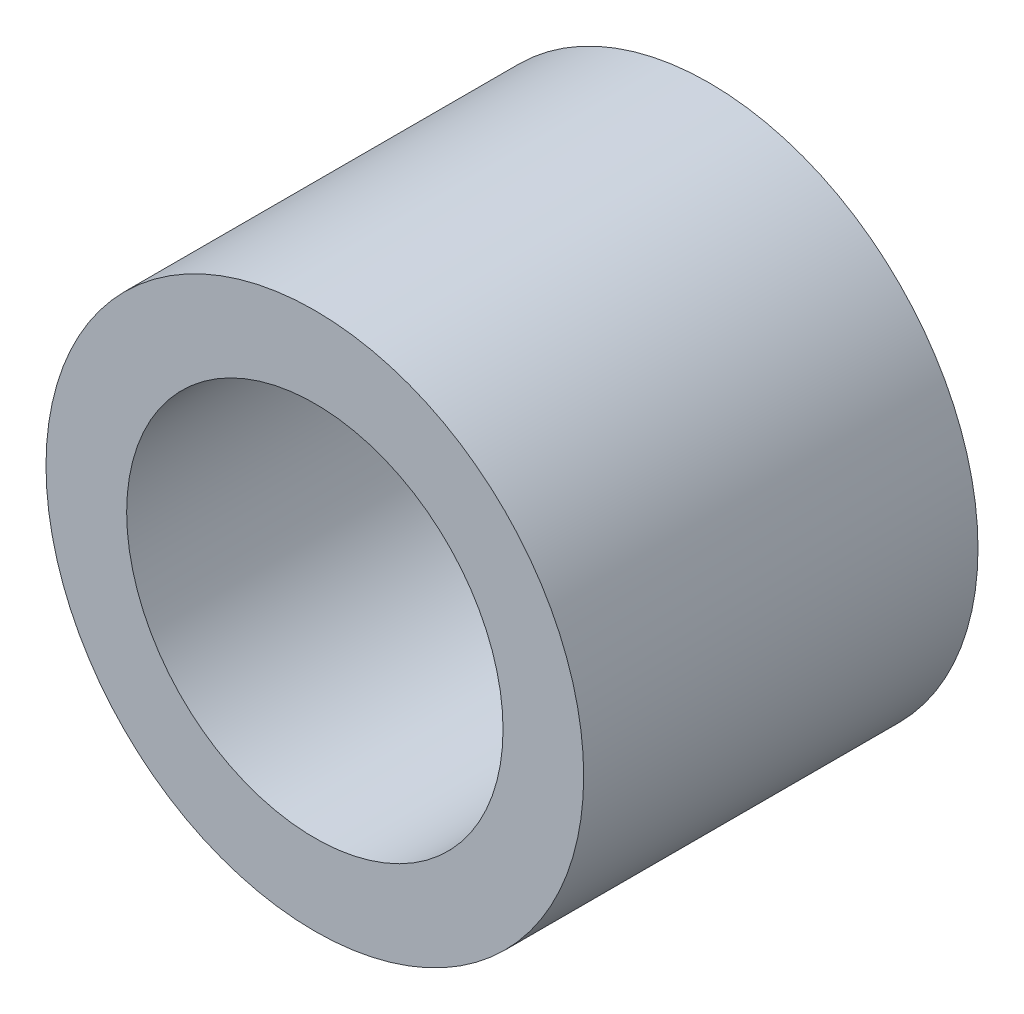
ISO-10303-21;
HEADER;
FILE_DESCRIPTION(('STEP AP214'),'2;1');
FILE_NAME('part.step','',(''),(''),'','','');
FILE_SCHEMA(('AUTOMOTIVE_DESIGN { 1 0 10303 214 1 1 1 1 }'));
ENDSEC;
DATA;
#1=APPLICATION_CONTEXT('core data for automotive mechanical design processes');
#2=APPLICATION_PROTOCOL_DEFINITION('international standard','automotive_design',2000,#1);
#3=PRODUCT_CONTEXT('',#1,'mechanical');
#4=PRODUCT('Part','Part','',(#3));
#5=PRODUCT_RELATED_PRODUCT_CATEGORY('part','',(#4));
#6=PRODUCT_DEFINITION_FORMATION('','',#4);
#7=PRODUCT_DEFINITION_CONTEXT('part definition',#1,'design');
#8=PRODUCT_DEFINITION('design','',#6,#7);
#9=PRODUCT_DEFINITION_SHAPE('','',#8);
#10=(LENGTH_UNIT() NAMED_UNIT(*) SI_UNIT(.MILLI.,.METRE.));
#11=(NAMED_UNIT(*) PLANE_ANGLE_UNIT() SI_UNIT($,.RADIAN.));
#12=(NAMED_UNIT(*) SI_UNIT($,.STERADIAN.) SOLID_ANGLE_UNIT());
#13=UNCERTAINTY_MEASURE_WITH_UNIT(LENGTH_MEASURE(1.E-05),#10,'distance_accuracy_value','');
#14=(GEOMETRIC_REPRESENTATION_CONTEXT(3) GLOBAL_UNCERTAINTY_ASSIGNED_CONTEXT((#13)) GLOBAL_UNIT_ASSIGNED_CONTEXT((#10,
#11,#12)) REPRESENTATION_CONTEXT('',''));
#15=CARTESIAN_POINT('',(0.,0.,0.));
#16=DIRECTION('',(0.,0.,1.));
#17=DIRECTION('',(1.,0.,0.));
#18=AXIS2_PLACEMENT_3D('',#15,#16,#17);
#19=CARTESIAN_POINT('',(0.,0.,0.));
#20=DIRECTION('',(0.,0.,1.));
#21=DIRECTION('',(1.,0.,0.));
#22=AXIS2_PLACEMENT_3D('',#19,#20,#21);
#23=PLANE('',#22);
#24=CARTESIAN_POINT('',(0.,0.,0.));
#25=DIRECTION('',(0.,0.,-1.));
#26=DIRECTION('',(-1.,0.,0.));
#27=AXIS2_PLACEMENT_3D('',#24,#25,#26);
#28=CIRCLE('',#27,11.);
#29=CARTESIAN_POINT('',(-11.,0.,0.));
#30=VERTEX_POINT('',#29);
#31=EDGE_CURVE('E239',#30,#30,#28,.T.);
#32=ORIENTED_EDGE('',*,*,#31,.F.);
#33=EDGE_LOOP('',(#32));
#34=FACE_BOUND('',#33,.T.);
#35=CARTESIAN_POINT('',(0.,0.,0.));
#36=DIRECTION('',(0.,0.,1.));
#37=DIRECTION('',(1.,0.,0.));
#38=AXIS2_PLACEMENT_3D('',#35,#36,#37);
#39=CIRCLE('',#38,15.);
#40=CARTESIAN_POINT('',(15.,0.,0.));
#41=VERTEX_POINT('',#40);
#42=EDGE_CURVE('E57',#41,#41,#39,.T.);
#43=ORIENTED_EDGE('',*,*,#42,.F.);
#44=EDGE_LOOP('',(#43));
#45=FACE_BOUND('',#44,.T.);
#46=ADVANCED_FACE('F47',(#34,#45),#23,.F.);
#47=CARTESIAN_POINT('',(0.,0.,22.));
#48=DIRECTION('',(0.,0.,-1.));
#49=DIRECTION('',(-1.,0.,0.));
#50=AXIS2_PLACEMENT_3D('',#47,#48,#49);
#51=CYLINDRICAL_SURFACE('',#50,15.);
#52=CARTESIAN_POINT('',(0.,0.,22.));
#53=DIRECTION('',(0.,0.,1.));
#54=DIRECTION('',(1.,0.,0.));
#55=AXIS2_PLACEMENT_3D('',#52,#53,#54);
#56=CIRCLE('',#55,15.);
#57=CARTESIAN_POINT('',(15.,0.,22.));
#58=VERTEX_POINT('',#57);
#59=EDGE_CURVE('E11',#58,#58,#56,.T.);
#60=ORIENTED_EDGE('',*,*,#59,.F.);
#61=EDGE_LOOP('',(#60));
#62=FACE_BOUND('',#61,.T.);
#63=ORIENTED_EDGE('',*,*,#42,.T.);
#64=EDGE_LOOP('',(#63));
#65=FACE_BOUND('',#64,.T.);
#66=ADVANCED_FACE('F49',(#62,#65),#51,.T.);
#67=CARTESIAN_POINT('',(0.,0.,22.));
#68=DIRECTION('',(0.,0.,1.));
#69=DIRECTION('',(1.,0.,0.));
#70=AXIS2_PLACEMENT_3D('',#67,#68,#69);
#71=PLANE('',#70);
#72=CARTESIAN_POINT('',(0.,0.,22.));
#73=DIRECTION('',(0.,0.,1.));
#74=DIRECTION('',(1.,0.,0.));
#75=AXIS2_PLACEMENT_3D('',#72,#73,#74);
#76=CIRCLE('',#75,10.5);
#77=CARTESIAN_POINT('',(10.5,0.,22.));
#78=VERTEX_POINT('',#77);
#79=EDGE_CURVE('E186',#78,#78,#76,.T.);
#80=ORIENTED_EDGE('',*,*,#79,.F.);
#81=EDGE_LOOP('',(#80));
#82=FACE_BOUND('',#81,.T.);
#83=ORIENTED_EDGE('',*,*,#59,.T.);
#84=EDGE_LOOP('',(#83));
#85=FACE_BOUND('',#84,.T.);
#86=ADVANCED_FACE('F200',(#82,#85),#71,.T.);
#87=CARTESIAN_POINT('',(0.,0.,6.));
#88=DIRECTION('',(0.,0.,1.));
#89=DIRECTION('',(1.,0.,0.));
#90=AXIS2_PLACEMENT_3D('',#87,#88,#89);
#91=CYLINDRICAL_SURFACE('',#90,10.5);
#92=CARTESIAN_POINT('',(0.,0.,6.));
#93=DIRECTION('',(0.,0.,1.));
#94=DIRECTION('',(1.,0.,0.));
#95=AXIS2_PLACEMENT_3D('',#92,#93,#94);
#96=CIRCLE('',#95,10.5);
#97=CARTESIAN_POINT('',(10.5,0.,6.));
#98=VERTEX_POINT('',#97);
#99=EDGE_CURVE('E183',#98,#98,#96,.T.);
#100=ORIENTED_EDGE('',*,*,#99,.F.);
#101=EDGE_LOOP('',(#100));
#102=FACE_BOUND('',#101,.T.);
#103=ORIENTED_EDGE('',*,*,#79,.T.);
#104=EDGE_LOOP('',(#103));
#105=FACE_BOUND('',#104,.T.);
#106=ADVANCED_FACE('F552',(#102,#105),#91,.F.);
#107=CARTESIAN_POINT('',(0.,0.,6.));
#108=DIRECTION('',(0.,0.,1.));
#109=DIRECTION('',(1.,0.,0.));
#110=AXIS2_PLACEMENT_3D('',#107,#108,#109);
#111=PLANE('',#110);
#112=CARTESIAN_POINT('',(0.,0.,6.));
#113=DIRECTION('',(0.,0.,1.));
#114=DIRECTION('',(1.,0.,0.));
#115=AXIS2_PLACEMENT_3D('',#112,#113,#114);
#116=CIRCLE('',#115,1.25);
#117=CARTESIAN_POINT('',(1.25,0.,6.));
#118=VERTEX_POINT('',#117);
#119=EDGE_CURVE('E220',#118,#118,#116,.T.);
#120=ORIENTED_EDGE('',*,*,#119,.F.);
#121=EDGE_LOOP('',(#120));
#122=FACE_BOUND('',#121,.T.);
#123=ORIENTED_EDGE('',*,*,#99,.T.);
#124=EDGE_LOOP('',(#123));
#125=FACE_BOUND('',#124,.T.);
#126=ADVANCED_FACE('F549',(#122,#125),#111,.T.);
#127=CARTESIAN_POINT('',(0.,0.,1.));
#128=DIRECTION('',(0.,0.,-1.));
#129=DIRECTION('',(-1.,0.,0.));
#130=AXIS2_PLACEMENT_3D('',#127,#128,#129);
#131=CYLINDRICAL_SURFACE('',#130,10.5);
#132=DIRECTION('',(0.,0.,-1.));
#133=VECTOR('',#132,1.);
#134=CARTESIAN_POINT('',(9.65360038987152,4.13013311076684,1.));
#135=LINE('',#134,#133);
#136=CARTESIAN_POINT('',(9.65360038987239,4.13013311076722,1.));
#137=VERTEX_POINT('',#136);
#138=CARTESIAN_POINT('',(9.65360038987239,4.13013311076722,0.));
#139=VERTEX_POINT('',#138);
#140=EDGE_CURVE('E313',#137,#139,#135,.T.);
#141=ORIENTED_EDGE('',*,*,#140,.F.);
#142=CARTESIAN_POINT('',(0.,0.,1.));
#143=DIRECTION('',(0.,0.,-1.));
#144=DIRECTION('',(-1.,0.,0.));
#145=AXIS2_PLACEMENT_3D('',#142,#143,#144);
#146=CIRCLE('',#145,10.5);
#147=CARTESIAN_POINT('',(9.65360038987158,-4.1301331107691,1.));
#148=VERTEX_POINT('',#147);
#149=EDGE_CURVE('E435',#137,#148,#146,.T.);
#150=ORIENTED_EDGE('',*,*,#149,.T.);
#151=DIRECTION('',(0.,0.,-1.));
#152=VECTOR('',#151,1.);
#153=CARTESIAN_POINT('',(9.65360038987044,-4.13013311076844,1.));
#154=LINE('',#153,#152);
#155=CARTESIAN_POINT('',(9.65360038987164,-4.13013311076895,0.));
#156=VERTEX_POINT('',#155);
#157=EDGE_CURVE('E277',#148,#156,#154,.T.);
#158=ORIENTED_EDGE('',*,*,#157,.T.);
#159=CARTESIAN_POINT('',(0.,0.,0.));
#160=DIRECTION('',(0.,0.,-1.));
#161=DIRECTION('',(-1.,0.,0.));
#162=AXIS2_PLACEMENT_3D('',#159,#160,#161);
#163=CIRCLE('',#162,10.5);
#164=EDGE_CURVE('E476',#139,#156,#163,.T.);
#165=ORIENTED_EDGE('',*,*,#164,.F.);
#166=EDGE_LOOP('',(#141,#150,#158,#165));
#167=FACE_BOUND('',#166,.T.);
#168=ADVANCED_FACE('F463',(#167),#131,.T.);
#169=DIRECTION('',(0.,0.,-1.));
#170=VECTOR('',#169,1.);
#171=CARTESIAN_POINT('',(-8.4036003898726,6.29519662022981,1.));
#172=LINE('',#171,#170);
#173=CARTESIAN_POINT('',(-8.40360038987185,6.29519662022924,1.));
#174=VERTEX_POINT('',#173);
#175=CARTESIAN_POINT('',(-8.40360038987185,6.29519662022924,0.));
#176=VERTEX_POINT('',#175);
#177=EDGE_CURVE('E340',#174,#176,#172,.T.);
#178=ORIENTED_EDGE('',*,*,#177,.F.);
#179=CARTESIAN_POINT('',(-1.25,10.4253297309965,1.));
#180=VERTEX_POINT('',#179);
#181=EDGE_CURVE('E233',#174,#180,#146,.T.);
#182=ORIENTED_EDGE('',*,*,#181,.T.);
#183=DIRECTION('',(0.,0.,-1.));
#184=VECTOR('',#183,1.);
#185=CARTESIAN_POINT('',(-1.25,10.4253297309965,1.));
#186=LINE('',#185,#184);
#187=CARTESIAN_POINT('',(-1.25,10.4253297309965,0.));
#188=VERTEX_POINT('',#187);
#189=EDGE_CURVE('E250',#180,#188,#186,.T.);
#190=ORIENTED_EDGE('',*,*,#189,.T.);
#191=EDGE_CURVE('E228',#176,#188,#163,.T.);
#192=ORIENTED_EDGE('',*,*,#191,.F.);
#193=EDGE_LOOP('',(#178,#182,#190,#192));
#194=FACE_BOUND('',#193,.T.);
#195=ADVANCED_FACE('F512',(#194),#131,.T.);
#196=CARTESIAN_POINT('',(-9.65360038987282,-4.13013311076621,0.));
#197=VERTEX_POINT('',#196);
#198=CARTESIAN_POINT('',(-9.65360038987188,4.1301331107684,0.));
#199=VERTEX_POINT('',#198);
#200=EDGE_CURVE('E222',#197,#199,#163,.T.);
#201=ORIENTED_EDGE('',*,*,#200,.F.);
#202=DIRECTION('',(0.,0.,-1.));
#203=VECTOR('',#202,1.);
#204=CARTESIAN_POINT('',(-9.65360038987368,-4.13013311076658,1.));
#205=LINE('',#204,#203);
#206=CARTESIAN_POINT('',(-9.65360038987282,-4.13013311076621,1.));
#207=VERTEX_POINT('',#206);
#208=EDGE_CURVE('E365',#207,#197,#205,.T.);
#209=ORIENTED_EDGE('',*,*,#208,.F.);
#210=CARTESIAN_POINT('',(-9.65360038987192,4.13013311076832,1.));
#211=VERTEX_POINT('',#210);
#212=EDGE_CURVE('E230',#207,#211,#146,.T.);
#213=ORIENTED_EDGE('',*,*,#212,.T.);
#214=DIRECTION('',(0.,0.,-1.));
#215=VECTOR('',#214,1.);
#216=CARTESIAN_POINT('',(-9.6536003898726,4.13013311076871,1.));
#217=LINE('',#216,#215);
#218=EDGE_CURVE('E327',#211,#199,#217,.T.);
#219=ORIENTED_EDGE('',*,*,#218,.T.);
#220=EDGE_LOOP('',(#201,#209,#213,#219));
#221=FACE_BOUND('',#220,.T.);
#222=ADVANCED_FACE('F497',(#221),#131,.T.);
#223=CARTESIAN_POINT('',(-1.25000000000216,-10.4253297309963,0.));
#224=VERTEX_POINT('',#223);
#225=CARTESIAN_POINT('',(-8.40360038987326,-6.29519662022736,0.));
#226=VERTEX_POINT('',#225);
#227=EDGE_CURVE('E226',#224,#226,#163,.T.);
#228=ORIENTED_EDGE('',*,*,#227,.F.);
#229=DIRECTION('',(0.,0.,-1.));
#230=VECTOR('',#229,1.);
#231=CARTESIAN_POINT('',(-1.25000000000215,-10.4253297309962,1.));
#232=LINE('',#231,#230);
#233=CARTESIAN_POINT('',(-1.25000000000216,-10.4253297309963,1.));
#234=VERTEX_POINT('',#233);
#235=EDGE_CURVE('E177',#234,#224,#232,.T.);
#236=ORIENTED_EDGE('',*,*,#235,.F.);
#237=CARTESIAN_POINT('',(-8.40360038987322,-6.29519662022741,1.));
#238=VERTEX_POINT('',#237);
#239=EDGE_CURVE('E232',#234,#238,#146,.T.);
#240=ORIENTED_EDGE('',*,*,#239,.T.);
#241=DIRECTION('',(0.,0.,-1.));
#242=VECTOR('',#241,1.);
#243=CARTESIAN_POINT('',(-8.40360038987368,-6.29519662022767,1.));
#244=LINE('',#243,#242);
#245=EDGE_CURVE('E354',#238,#226,#244,.T.);
#246=ORIENTED_EDGE('',*,*,#245,.T.);
#247=EDGE_LOOP('',(#228,#236,#240,#246));
#248=FACE_BOUND('',#247,.T.);
#249=ADVANCED_FACE('F670',(#248),#131,.T.);
#250=CARTESIAN_POINT('',(8.4036003898712,-6.29519662023011,0.));
#251=VERTEX_POINT('',#250);
#252=CARTESIAN_POINT('',(1.24999999999791,-10.4253297309968,0.));
#253=VERTEX_POINT('',#252);
#254=EDGE_CURVE('E166',#251,#253,#163,.T.);
#255=ORIENTED_EDGE('',*,*,#254,.F.);
#256=DIRECTION('',(0.,0.,-1.));
#257=VECTOR('',#256,1.);
#258=CARTESIAN_POINT('',(8.40360038987044,-6.29519662022954,1.));
#259=LINE('',#258,#257);
#260=CARTESIAN_POINT('',(8.4036003898712,-6.29519662023011,1.));
#261=VERTEX_POINT('',#260);
#262=EDGE_CURVE('E286',#261,#251,#259,.T.);
#263=ORIENTED_EDGE('',*,*,#262,.F.);
#264=CARTESIAN_POINT('',(1.24999999999785,-10.4253297309968,1.));
#265=VERTEX_POINT('',#264);
#266=EDGE_CURVE('E381',#261,#265,#146,.T.);
#267=ORIENTED_EDGE('',*,*,#266,.T.);
#268=DIRECTION('',(0.,0.,-1.));
#269=VECTOR('',#268,1.);
#270=CARTESIAN_POINT('',(1.24999999999785,-10.4253297309962,1.));
#271=LINE('',#270,#269);
#272=EDGE_CURVE('E180',#265,#253,#271,.T.);
#273=ORIENTED_EDGE('',*,*,#272,.T.);
#274=EDGE_LOOP('',(#255,#263,#267,#273));
#275=FACE_BOUND('',#274,.T.);
#276=ADVANCED_FACE('F657',(#275),#131,.T.);
#277=CARTESIAN_POINT('',(0.,0.,1.));
#278=DIRECTION('',(0.,0.,-1.));
#279=DIRECTION('',(-1.,0.,0.));
#280=AXIS2_PLACEMENT_3D('',#277,#278,#279);
#281=CYLINDRICAL_SURFACE('',#280,11.);
#282=CARTESIAN_POINT('',(0.,0.,1.));
#283=DIRECTION('',(0.,0.,-1.));
#284=DIRECTION('',(-1.,0.,0.));
#285=AXIS2_PLACEMENT_3D('',#282,#283,#284);
#286=CIRCLE('',#285,11.);
#287=CARTESIAN_POINT('',(-11.,0.,1.));
#288=VERTEX_POINT('',#287);
#289=EDGE_CURVE('E235',#288,#288,#286,.T.);
#290=ORIENTED_EDGE('',*,*,#289,.F.);
#291=EDGE_LOOP('',(#290));
#292=FACE_BOUND('',#291,.T.);
#293=ORIENTED_EDGE('',*,*,#31,.T.);
#294=EDGE_LOOP('',(#293));
#295=FACE_BOUND('',#294,.T.);
#296=ADVANCED_FACE('F655',(#292,#295),#281,.F.);
#297=CARTESIAN_POINT('',(1.25,10.4253297309965,0.));
#298=VERTEX_POINT('',#297);
#299=CARTESIAN_POINT('',(8.40360038987235,6.29519662022857,0.));
#300=VERTEX_POINT('',#299);
#301=EDGE_CURVE('E437',#298,#300,#163,.T.);
#302=ORIENTED_EDGE('',*,*,#301,.F.);
#303=DIRECTION('',(0.,0.,-1.));
#304=VECTOR('',#303,1.);
#305=CARTESIAN_POINT('',(1.25,10.4253297309965,1.));
#306=LINE('',#305,#304);
#307=CARTESIAN_POINT('',(1.25,10.4253297309965,1.));
#308=VERTEX_POINT('',#307);
#309=EDGE_CURVE('E263',#308,#298,#306,.T.);
#310=ORIENTED_EDGE('',*,*,#309,.F.);
#311=CARTESIAN_POINT('',(8.40360038987243,6.29519662022847,1.));
#312=VERTEX_POINT('',#311);
#313=EDGE_CURVE('E428',#308,#312,#146,.T.);
#314=ORIENTED_EDGE('',*,*,#313,.T.);
#315=DIRECTION('',(0.,0.,-1.));
#316=VECTOR('',#315,1.);
#317=CARTESIAN_POINT('',(8.40360038987152,6.29519662022794,1.));
#318=LINE('',#317,#316);
#319=EDGE_CURVE('E300',#312,#300,#318,.T.);
#320=ORIENTED_EDGE('',*,*,#319,.T.);
#321=EDGE_LOOP('',(#302,#310,#314,#320));
#322=FACE_BOUND('',#321,.T.);
#323=ADVANCED_FACE('F436',(#322),#131,.T.);
#324=CARTESIAN_POINT('',(8.2272413359513,4.74999999999949,1.));
#325=DIRECTION('',(-0.866025403784439,-0.499999999999999,0.));
#326=DIRECTION('',(0.499999999999999,-0.866025403784439,0.));
#327=AXIS2_PLACEMENT_3D('',#324,#325,#326);
#328=PLANE('',#327);
#329=DIRECTION('',(-0.499999999999999,0.866025403784439,0.));
#330=VECTOR('',#329,1.);
#331=CARTESIAN_POINT('',(8.2272413359513,4.74999999999949,0.));
#332=LINE('',#331,#330);
#333=CARTESIAN_POINT('',(8.85224133595151,3.66746824526859,0.));
#334=VERTEX_POINT('',#333);
#335=CARTESIAN_POINT('',(7.60224133595151,5.83253175472968,0.));
#336=VERTEX_POINT('',#335);
#337=EDGE_CURVE('E294',#334,#336,#332,.T.);
#338=ORIENTED_EDGE('',*,*,#337,.T.);
#339=DIRECTION('',(0.,0.,-1.));
#340=VECTOR('',#339,1.);
#341=CARTESIAN_POINT('',(7.60224133595151,5.83253175472968,1.));
#342=LINE('',#341,#340);
#343=CARTESIAN_POINT('',(7.60224133595151,5.83253175472968,1.));
#344=VERTEX_POINT('',#343);
#345=EDGE_CURVE('E255',#344,#336,#342,.T.);
#346=ORIENTED_EDGE('',*,*,#345,.F.);
#347=DIRECTION('',(-0.499999999999999,0.866025403784439,0.));
#348=VECTOR('',#347,1.);
#349=CARTESIAN_POINT('',(8.2272413359513,4.74999999999949,1.));
#350=LINE('',#349,#348);
#351=CARTESIAN_POINT('',(8.85224133595151,3.66746824526859,1.));
#352=VERTEX_POINT('',#351);
#353=EDGE_CURVE('E297',#352,#344,#350,.T.);
#354=ORIENTED_EDGE('',*,*,#353,.F.);
#355=DIRECTION('',(0.,0.,-1.));
#356=VECTOR('',#355,1.);
#357=CARTESIAN_POINT('',(8.85224133595151,3.66746824526859,1.));
#358=LINE('',#357,#356);
#359=EDGE_CURVE('E311',#352,#334,#358,.T.);
#360=ORIENTED_EDGE('',*,*,#359,.T.);
#361=EDGE_LOOP('',(#338,#346,#354,#360));
#362=FACE_BOUND('',#361,.T.);
#363=ADVANCED_FACE('F518',(#362),#328,.F.);
#364=CARTESIAN_POINT('',(-8.22724133595292,4.75000000000044,1.));
#365=DIRECTION('',(0.866025403784438,-0.5,0.));
#366=DIRECTION('',(0.5,0.866025403784438,0.));
#367=AXIS2_PLACEMENT_3D('',#364,#365,#366);
#368=PLANE('',#367);
#369=DIRECTION('',(-0.5,-0.866025403784438,0.));
#370=VECTOR('',#369,1.);
#371=CARTESIAN_POINT('',(-8.22724133595292,4.75000000000044,0.));
#372=LINE('',#371,#370);
#373=CARTESIAN_POINT('',(-7.60224133595259,5.83253175473155,0.));
#374=VERTEX_POINT('',#373);
#375=CARTESIAN_POINT('',(-8.8522413359526,3.66746824527045,0.));
#376=VERTEX_POINT('',#375);
#377=EDGE_CURVE('E321',#374,#376,#372,.T.);
#378=ORIENTED_EDGE('',*,*,#377,.T.);
#379=DIRECTION('',(0.,0.,-1.));
#380=VECTOR('',#379,1.);
#381=CARTESIAN_POINT('',(-8.8522413359526,3.66746824527045,1.));
#382=LINE('',#381,#380);
#383=CARTESIAN_POINT('',(-8.8522413359526,3.66746824527045,1.));
#384=VERTEX_POINT('',#383);
#385=EDGE_CURVE('E305',#384,#376,#382,.T.);
#386=ORIENTED_EDGE('',*,*,#385,.F.);
#387=DIRECTION('',(-0.5,-0.866025403784438,0.));
#388=VECTOR('',#387,1.);
#389=CARTESIAN_POINT('',(-8.22724133595292,4.75000000000044,1.));
#390=LINE('',#389,#388);
#391=CARTESIAN_POINT('',(-7.60224133595259,5.83253175473155,1.));
#392=VERTEX_POINT('',#391);
#393=EDGE_CURVE('E324',#392,#384,#390,.T.);
#394=ORIENTED_EDGE('',*,*,#393,.F.);
#395=DIRECTION('',(0.,0.,-1.));
#396=VECTOR('',#395,1.);
#397=CARTESIAN_POINT('',(-7.60224133595259,5.83253175473155,1.));
#398=LINE('',#397,#396);
#399=EDGE_CURVE('E338',#392,#374,#398,.T.);
#400=ORIENTED_EDGE('',*,*,#399,.T.);
#401=EDGE_LOOP('',(#378,#386,#394,#400));
#402=FACE_BOUND('',#401,.T.);
#403=ADVANCED_FACE('F505',(#402),#368,.F.);
#404=CARTESIAN_POINT('',(-8.2272413359528,-4.75000000000037,1.));
#405=DIRECTION('',(0.866025403784438,0.5,0.));
#406=DIRECTION('',(-0.5,0.866025403784439,0.));
#407=AXIS2_PLACEMENT_3D('',#404,#405,#406);
#408=PLANE('',#407);
#409=DIRECTION('',(0.5,-0.866025403784439,0.));
#410=VECTOR('',#409,1.);
#411=CARTESIAN_POINT('',(-8.2272413359528,-4.75000000000037,0.));
#412=LINE('',#411,#410);
#413=CARTESIAN_POINT('',(-8.85224133595367,-3.66746824526832,0.));
#414=VERTEX_POINT('',#413);
#415=CARTESIAN_POINT('',(-7.60224133595367,-5.83253175472941,0.));
#416=VERTEX_POINT('',#415);
#417=EDGE_CURVE('E348',#414,#416,#412,.T.);
#418=ORIENTED_EDGE('',*,*,#417,.T.);
#419=DIRECTION('',(0.,0.,-1.));
#420=VECTOR('',#419,1.);
#421=CARTESIAN_POINT('',(-7.60224133595367,-5.83253175472941,1.));
#422=LINE('',#421,#420);
#423=CARTESIAN_POINT('',(-7.60224133595367,-5.83253175472941,1.));
#424=VERTEX_POINT('',#423);
#425=EDGE_CURVE('E332',#424,#416,#422,.T.);
#426=ORIENTED_EDGE('',*,*,#425,.F.);
#427=DIRECTION('',(0.5,-0.866025403784439,0.));
#428=VECTOR('',#427,1.);
#429=CARTESIAN_POINT('',(-8.2272413359528,-4.75000000000037,1.));
#430=LINE('',#429,#428);
#431=CARTESIAN_POINT('',(-8.85224133595367,-3.66746824526832,1.));
#432=VERTEX_POINT('',#431);
#433=EDGE_CURVE('E351',#432,#424,#430,.T.);
#434=ORIENTED_EDGE('',*,*,#433,.F.);
#435=DIRECTION('',(0.,0.,-1.));
#436=VECTOR('',#435,1.);
#437=CARTESIAN_POINT('',(-8.85224133595367,-3.66746824526832,1.));
#438=LINE('',#437,#436);
#439=EDGE_CURVE('E363',#432,#414,#438,.T.);
#440=ORIENTED_EDGE('',*,*,#439,.T.);
#441=EDGE_LOOP('',(#418,#426,#434,#440));
#442=FACE_BOUND('',#441,.T.);
#443=ADVANCED_FACE('F489',(#442),#408,.F.);
#444=CARTESIAN_POINT('',(0.,-9.49999999999973,1.));
#445=DIRECTION('',(0.,1.,0.));
#446=DIRECTION('',(0.,0.,1.));
#447=AXIS2_PLACEMENT_3D('',#444,#445,#446);
#448=PLANE('',#447);
#449=DIRECTION('',(1.,0.,0.));
#450=VECTOR('',#449,1.);
#451=CARTESIAN_POINT('',(0.,-9.49999999999973,0.));
#452=LINE('',#451,#450);
#453=CARTESIAN_POINT('',(-1.25000000000215,-9.49999999999973,0.));
#454=VERTEX_POINT('',#453);
#455=CARTESIAN_POINT('',(1.24999999999785,-9.49999999999973,0.));
#456=VERTEX_POINT('',#455);
#457=EDGE_CURVE('E155',#454,#456,#452,.T.);
#458=ORIENTED_EDGE('',*,*,#457,.T.);
#459=DIRECTION('',(0.,0.,-1.));
#460=VECTOR('',#459,1.);
#461=CARTESIAN_POINT('',(1.24999999999785,-9.49999999999973,1.));
#462=LINE('',#461,#460);
#463=CARTESIAN_POINT('',(1.24999999999785,-9.49999999999973,1.));
#464=VERTEX_POINT('',#463);
#465=EDGE_CURVE('E143',#464,#456,#462,.T.);
#466=ORIENTED_EDGE('',*,*,#465,.F.);
#467=DIRECTION('',(1.,0.,0.));
#468=VECTOR('',#467,1.);
#469=CARTESIAN_POINT('',(0.,-9.49999999999973,1.));
#470=LINE('',#469,#468);
#471=CARTESIAN_POINT('',(-1.25000000000215,-9.49999999999973,1.));
#472=VERTEX_POINT('',#471);
#473=EDGE_CURVE('E173',#472,#464,#470,.T.);
#474=ORIENTED_EDGE('',*,*,#473,.F.);
#475=DIRECTION('',(0.,0.,-1.));
#476=VECTOR('',#475,1.);
#477=CARTESIAN_POINT('',(-1.25000000000215,-9.49999999999973,1.));
#478=LINE('',#477,#476);
#479=EDGE_CURVE('E137',#472,#454,#478,.T.);
#480=ORIENTED_EDGE('',*,*,#479,.T.);
#481=EDGE_LOOP('',(#458,#466,#474,#480));
#482=FACE_BOUND('',#481,.T.);
#483=ADVANCED_FACE('F156',(#482),#448,.F.);
#484=CARTESIAN_POINT('',(8.22724133595118,-4.74999999999944,1.));
#485=DIRECTION('',(-0.866025403784438,0.500000000000001,0.));
#486=DIRECTION('',(-0.500000000000001,-0.866025403784438,0.));
#487=AXIS2_PLACEMENT_3D('',#484,#485,#486);
#488=PLANE('',#487);
#489=DIRECTION('',(0.500000000000001,0.866025403784438,0.));
#490=VECTOR('',#489,1.);
#491=CARTESIAN_POINT('',(8.22724133595118,-4.74999999999944,0.));
#492=LINE('',#491,#490);
#493=CARTESIAN_POINT('',(7.60224133595043,-5.83253175473128,0.));
#494=VERTEX_POINT('',#493);
#495=CARTESIAN_POINT('',(8.85224133595043,-3.66746824527018,0.));
#496=VERTEX_POINT('',#495);
#497=EDGE_CURVE('E271',#494,#496,#492,.T.);
#498=ORIENTED_EDGE('',*,*,#497,.T.);
#499=DIRECTION('',(0.,0.,-1.));
#500=VECTOR('',#499,1.);
#501=CARTESIAN_POINT('',(8.85224133595043,-3.66746824527018,1.));
#502=LINE('',#501,#500);
#503=CARTESIAN_POINT('',(8.85224133595043,-3.66746824527018,1.));
#504=VERTEX_POINT('',#503);
#505=EDGE_CURVE('E167',#504,#496,#502,.T.);
#506=ORIENTED_EDGE('',*,*,#505,.F.);
#507=DIRECTION('',(0.500000000000001,0.866025403784438,0.));
#508=VECTOR('',#507,1.);
#509=CARTESIAN_POINT('',(8.22724133595118,-4.74999999999944,1.));
#510=LINE('',#509,#508);
#511=CARTESIAN_POINT('',(7.60224133595043,-5.83253175473128,1.));
#512=VERTEX_POINT('',#511);
#513=EDGE_CURVE('E274',#512,#504,#510,.T.);
#514=ORIENTED_EDGE('',*,*,#513,.F.);
#515=DIRECTION('',(0.,0.,-1.));
#516=VECTOR('',#515,1.);
#517=CARTESIAN_POINT('',(7.60224133595043,-5.83253175473128,1.));
#518=LINE('',#517,#516);
#519=EDGE_CURVE('E170',#512,#494,#518,.T.);
#520=ORIENTED_EDGE('',*,*,#519,.T.);
#521=EDGE_LOOP('',(#498,#506,#514,#520));
#522=FACE_BOUND('',#521,.T.);
#523=ADVANCED_FACE('F473',(#522),#488,.F.);
#524=CARTESIAN_POINT('',(0.,9.5,1.));
#525=DIRECTION('',(0.,-1.,0.));
#526=DIRECTION('',(0.,0.,-1.));
#527=AXIS2_PLACEMENT_3D('',#524,#525,#526);
#528=PLANE('',#527);
#529=DIRECTION('',(-1.,0.,0.));
#530=VECTOR('',#529,1.);
#531=CARTESIAN_POINT('',(0.,9.5,0.));
#532=LINE('',#531,#530);
#533=CARTESIAN_POINT('',(1.25,9.5,0.));
#534=VERTEX_POINT('',#533);
#535=CARTESIAN_POINT('',(-1.25,9.5,0.));
#536=VERTEX_POINT('',#535);
#537=EDGE_CURVE('E244',#534,#536,#532,.T.);
#538=ORIENTED_EDGE('',*,*,#537,.T.);
#539=DIRECTION('',(0.,0.,-1.));
#540=VECTOR('',#539,1.);
#541=CARTESIAN_POINT('',(-1.25,9.5,1.));
#542=LINE('',#541,#540);
#543=CARTESIAN_POINT('',(-1.25,9.5,1.));
#544=VERTEX_POINT('',#543);
#545=EDGE_CURVE('E188',#544,#536,#542,.T.);
#546=ORIENTED_EDGE('',*,*,#545,.F.);
#547=DIRECTION('',(-1.,0.,0.));
#548=VECTOR('',#547,1.);
#549=CARTESIAN_POINT('',(0.,9.5,1.));
#550=LINE('',#549,#548);
#551=CARTESIAN_POINT('',(1.25,9.5,1.));
#552=VERTEX_POINT('',#551);
#553=EDGE_CURVE('E247',#552,#544,#550,.T.);
#554=ORIENTED_EDGE('',*,*,#553,.F.);
#555=DIRECTION('',(0.,0.,-1.));
#556=VECTOR('',#555,1.);
#557=CARTESIAN_POINT('',(1.25,9.5,1.));
#558=LINE('',#557,#556);
#559=EDGE_CURVE('E261',#552,#534,#558,.T.);
#560=ORIENTED_EDGE('',*,*,#559,.T.);
#561=EDGE_LOOP('',(#538,#546,#554,#560));
#562=FACE_BOUND('',#561,.T.);
#563=ADVANCED_FACE('F443',(#562),#528,.F.);
#564=CARTESIAN_POINT('',(0.,0.,1.));
#565=DIRECTION('',(0.,0.,-1.));
#566=DIRECTION('',(-1.,0.,0.));
#567=AXIS2_PLACEMENT_3D('',#564,#565,#566);
#568=PLANE('',#567);
#569=DIRECTION('',(0.,-1.,0.));
#570=VECTOR('',#569,1.);
#571=CARTESIAN_POINT('',(-1.25,0.,1.));
#572=LINE('',#571,#570);
#573=EDGE_CURVE('E66',#180,#544,#572,.T.);
#574=ORIENTED_EDGE('',*,*,#573,.F.);
#575=ORIENTED_EDGE('',*,*,#181,.F.);
#576=DIRECTION('',(0.866025403784438,-0.500000000000001,0.));
#577=VECTOR('',#576,1.);
#578=CARTESIAN_POINT('',(0.62500000000032,1.0825317547311,1.));
#579=LINE('',#578,#577);
#580=EDGE_CURVE('E320',#174,#392,#579,.T.);
#581=ORIENTED_EDGE('',*,*,#580,.T.);
#582=ORIENTED_EDGE('',*,*,#393,.T.);
#583=DIRECTION('',(0.866025403784438,-0.500000000000001,0.));
#584=VECTOR('',#583,1.);
#585=CARTESIAN_POINT('',(-0.624999999999682,-1.08253175472999,1.));
#586=LINE('',#585,#584);
#587=EDGE_CURVE('E318',#211,#384,#586,.T.);
#588=ORIENTED_EDGE('',*,*,#587,.F.);
#589=ORIENTED_EDGE('',*,*,#212,.F.);
#590=DIRECTION('',(0.866025403784439,0.5,0.));
#591=VECTOR('',#590,1.);
#592=CARTESIAN_POINT('',(-0.625000000000867,1.08253175473205,1.));
#593=LINE('',#592,#591);
#594=EDGE_CURVE('E347',#207,#432,#593,.T.);
#595=ORIENTED_EDGE('',*,*,#594,.T.);
#596=ORIENTED_EDGE('',*,*,#433,.T.);
#597=DIRECTION('',(0.866025403784439,0.499999999999999,0.));
#598=VECTOR('',#597,1.);
#599=CARTESIAN_POINT('',(0.624999999999138,-1.08253175472906,1.));
#600=LINE('',#599,#598);
#601=EDGE_CURVE('E345',#238,#424,#600,.T.);
#602=ORIENTED_EDGE('',*,*,#601,.F.);
#603=ORIENTED_EDGE('',*,*,#239,.F.);
#604=DIRECTION('',(0.,1.,0.));
#605=VECTOR('',#604,1.);
#606=CARTESIAN_POINT('',(-1.25000000000215,0.,1.));
#607=LINE('',#606,#605);
#608=EDGE_CURVE('E370',#234,#472,#607,.T.);
#609=ORIENTED_EDGE('',*,*,#608,.T.);
#610=ORIENTED_EDGE('',*,*,#473,.T.);
#611=DIRECTION('',(0.,1.,0.));
#612=VECTOR('',#611,1.);
#613=CARTESIAN_POINT('',(1.24999999999785,0.,1.));
#614=LINE('',#613,#612);
#615=EDGE_CURVE('E150',#265,#464,#614,.T.);
#616=ORIENTED_EDGE('',*,*,#615,.F.);
#617=ORIENTED_EDGE('',*,*,#266,.F.);
#618=DIRECTION('',(-0.866025403784438,0.500000000000001,0.));
#619=VECTOR('',#618,1.);
#620=CARTESIAN_POINT('',(-0.625000000000747,-1.08253175473184,1.));
#621=LINE('',#620,#619);
#622=EDGE_CURVE('E270',#261,#512,#621,.T.);
#623=ORIENTED_EDGE('',*,*,#622,.T.);
#624=ORIENTED_EDGE('',*,*,#513,.T.);
#625=DIRECTION('',(-0.866025403784439,0.5,0.));
#626=VECTOR('',#625,1.);
#627=CARTESIAN_POINT('',(0.624999999999252,1.08253175472925,1.));
#628=LINE('',#627,#626);
#629=EDGE_CURVE('E268',#148,#504,#628,.T.);
#630=ORIENTED_EDGE('',*,*,#629,.F.);
#631=ORIENTED_EDGE('',*,*,#149,.F.);
#632=DIRECTION('',(-0.86602540378444,-0.499999999999998,0.));
#633=VECTOR('',#632,1.);
#634=CARTESIAN_POINT('',(0.625000000000198,-1.0825317547309,1.));
#635=LINE('',#634,#633);
#636=EDGE_CURVE('E293',#137,#352,#635,.T.);
#637=ORIENTED_EDGE('',*,*,#636,.T.);
#638=ORIENTED_EDGE('',*,*,#353,.T.);
#639=DIRECTION('',(-0.866025403784439,-0.499999999999999,0.));
#640=VECTOR('',#639,1.);
#641=CARTESIAN_POINT('',(-0.624999999999794,1.08253175473019,1.));
#642=LINE('',#641,#640);
#643=EDGE_CURVE('E291',#312,#344,#642,.T.);
#644=ORIENTED_EDGE('',*,*,#643,.F.);
#645=ORIENTED_EDGE('',*,*,#313,.F.);
#646=DIRECTION('',(0.,-1.,0.));
#647=VECTOR('',#646,1.);
#648=CARTESIAN_POINT('',(1.25,0.,1.));
#649=LINE('',#648,#647);
#650=EDGE_CURVE('E243',#308,#552,#649,.T.);
#651=ORIENTED_EDGE('',*,*,#650,.T.);
#652=ORIENTED_EDGE('',*,*,#553,.T.);
#653=EDGE_LOOP('',(#574,#575,#581,#582,#588,#589,#595,#596,#602,#603,#609,#610,#616,#617,#623,
#624,#630,#631,#637,#638,#644,#645,#651,#652));
#654=FACE_BOUND('',#653,.T.);
#655=ORIENTED_EDGE('',*,*,#289,.T.);
#656=EDGE_LOOP('',(#655));
#657=FACE_BOUND('',#656,.T.);
#658=ADVANCED_FACE('F375',(#654,#657),#568,.T.);
#659=CARTESIAN_POINT('',(1.25,0.,1.));
#660=DIRECTION('',(1.,0.,0.));
#661=DIRECTION('',(0.,0.,-1.));
#662=AXIS2_PLACEMENT_3D('',#659,#660,#661);
#663=PLANE('',#662);
#664=DIRECTION('',(0.,-1.,0.));
#665=VECTOR('',#664,1.);
#666=CARTESIAN_POINT('',(1.25,0.,0.));
#667=LINE('',#666,#665);
#668=EDGE_CURVE('E254',#298,#534,#667,.T.);
#669=ORIENTED_EDGE('',*,*,#668,.T.);
#670=ORIENTED_EDGE('',*,*,#559,.F.);
#671=ORIENTED_EDGE('',*,*,#650,.F.);
#672=ORIENTED_EDGE('',*,*,#309,.T.);
#673=EDGE_LOOP('',(#669,#670,#671,#672));
#674=FACE_BOUND('',#673,.T.);
#675=ADVANCED_FACE('F440',(#674),#663,.F.);
#676=CARTESIAN_POINT('',(-1.25,0.,1.));
#677=DIRECTION('',(1.,0.,0.));
#678=DIRECTION('',(0.,0.,-1.));
#679=AXIS2_PLACEMENT_3D('',#676,#677,#678);
#680=PLANE('',#679);
#681=DIRECTION('',(0.,-1.,0.));
#682=VECTOR('',#681,1.);
#683=CARTESIAN_POINT('',(-1.25,0.,0.));
#684=LINE('',#683,#682);
#685=EDGE_CURVE('E251',#188,#536,#684,.T.);
#686=ORIENTED_EDGE('',*,*,#685,.F.);
#687=ORIENTED_EDGE('',*,*,#189,.F.);
#688=ORIENTED_EDGE('',*,*,#573,.T.);
#689=ORIENTED_EDGE('',*,*,#545,.T.);
#690=EDGE_LOOP('',(#686,#687,#688,#689));
#691=FACE_BOUND('',#690,.T.);
#692=ADVANCED_FACE('F513',(#691),#680,.T.);
#693=CARTESIAN_POINT('',(0.62500000000032,1.0825317547311,1.));
#694=DIRECTION('',(0.500000000000001,0.866025403784438,0.));
#695=DIRECTION('',(-0.866025403784438,0.500000000000001,0.));
#696=AXIS2_PLACEMENT_3D('',#693,#694,#695);
#697=PLANE('',#696);
#698=DIRECTION('',(0.866025403784438,-0.500000000000001,0.));
#699=VECTOR('',#698,1.);
#700=CARTESIAN_POINT('',(0.62500000000032,1.0825317547311,0.));
#701=LINE('',#700,#699);
#702=EDGE_CURVE('E331',#176,#374,#701,.T.);
#703=ORIENTED_EDGE('',*,*,#702,.T.);
#704=ORIENTED_EDGE('',*,*,#399,.F.);
#705=ORIENTED_EDGE('',*,*,#580,.F.);
#706=ORIENTED_EDGE('',*,*,#177,.T.);
#707=EDGE_LOOP('',(#703,#704,#705,#706));
#708=FACE_BOUND('',#707,.T.);
#709=ADVANCED_FACE('F511',(#708),#697,.F.);
#710=CARTESIAN_POINT('',(-0.624999999999682,-1.08253175472999,1.));
#711=DIRECTION('',(0.500000000000001,0.866025403784438,0.));
#712=DIRECTION('',(-0.866025403784438,0.500000000000001,0.));
#713=AXIS2_PLACEMENT_3D('',#710,#711,#712);
#714=PLANE('',#713);
#715=DIRECTION('',(0.866025403784438,-0.500000000000001,0.));
#716=VECTOR('',#715,1.);
#717=CARTESIAN_POINT('',(-0.624999999999682,-1.08253175472999,0.));
#718=LINE('',#717,#716);
#719=EDGE_CURVE('E328',#199,#376,#718,.T.);
#720=ORIENTED_EDGE('',*,*,#719,.F.);
#721=ORIENTED_EDGE('',*,*,#218,.F.);
#722=ORIENTED_EDGE('',*,*,#587,.T.);
#723=ORIENTED_EDGE('',*,*,#385,.T.);
#724=EDGE_LOOP('',(#720,#721,#722,#723));
#725=FACE_BOUND('',#724,.T.);
#726=ADVANCED_FACE('F503',(#725),#714,.T.);
#727=CARTESIAN_POINT('',(-0.625000000000867,1.08253175473205,1.));
#728=DIRECTION('',(-0.5,0.866025403784439,0.));
#729=DIRECTION('',(-0.866025403784439,-0.5,0.));
#730=AXIS2_PLACEMENT_3D('',#727,#728,#729);
#731=PLANE('',#730);
#732=DIRECTION('',(0.866025403784439,0.5,0.));
#733=VECTOR('',#732,1.);
#734=CARTESIAN_POINT('',(-0.625000000000867,1.08253175473205,0.));
#735=LINE('',#734,#733);
#736=EDGE_CURVE('E357',#197,#414,#735,.T.);
#737=ORIENTED_EDGE('',*,*,#736,.T.);
#738=ORIENTED_EDGE('',*,*,#439,.F.);
#739=ORIENTED_EDGE('',*,*,#594,.F.);
#740=ORIENTED_EDGE('',*,*,#208,.T.);
#741=EDGE_LOOP('',(#737,#738,#739,#740));
#742=FACE_BOUND('',#741,.T.);
#743=ADVANCED_FACE('F493',(#742),#731,.F.);
#744=CARTESIAN_POINT('',(0.624999999999138,-1.08253175472906,1.));
#745=DIRECTION('',(-0.499999999999999,0.866025403784439,0.));
#746=DIRECTION('',(-0.866025403784439,-0.499999999999999,0.));
#747=AXIS2_PLACEMENT_3D('',#744,#745,#746);
#748=PLANE('',#747);
#749=DIRECTION('',(0.866025403784439,0.499999999999999,0.));
#750=VECTOR('',#749,1.);
#751=CARTESIAN_POINT('',(0.624999999999138,-1.08253175472906,0.));
#752=LINE('',#751,#750);
#753=EDGE_CURVE('E152',#226,#416,#752,.T.);
#754=ORIENTED_EDGE('',*,*,#753,.F.);
#755=ORIENTED_EDGE('',*,*,#245,.F.);
#756=ORIENTED_EDGE('',*,*,#601,.T.);
#757=ORIENTED_EDGE('',*,*,#425,.T.);
#758=EDGE_LOOP('',(#754,#755,#756,#757));
#759=FACE_BOUND('',#758,.T.);
#760=ADVANCED_FACE('F484',(#759),#748,.T.);
#761=CARTESIAN_POINT('',(-1.25000000000215,0.,1.));
#762=DIRECTION('',(-1.,0.,0.));
#763=DIRECTION('',(0.,-1.,0.));
#764=AXIS2_PLACEMENT_3D('',#761,#762,#763);
#765=PLANE('',#764);
#766=DIRECTION('',(0.,1.,0.));
#767=VECTOR('',#766,1.);
#768=CARTESIAN_POINT('',(-1.25000000000215,0.,0.));
#769=LINE('',#768,#767);
#770=EDGE_CURVE('E159',#224,#454,#769,.T.);
#771=ORIENTED_EDGE('',*,*,#770,.T.);
#772=ORIENTED_EDGE('',*,*,#479,.F.);
#773=ORIENTED_EDGE('',*,*,#608,.F.);
#774=ORIENTED_EDGE('',*,*,#235,.T.);
#775=EDGE_LOOP('',(#771,#772,#773,#774));
#776=FACE_BOUND('',#775,.T.);
#777=ADVANCED_FACE('F541',(#776),#765,.F.);
#778=CARTESIAN_POINT('',(1.24999999999785,0.,1.));
#779=DIRECTION('',(-1.,0.,0.));
#780=DIRECTION('',(0.,-1.,0.));
#781=AXIS2_PLACEMENT_3D('',#778,#779,#780);
#782=PLANE('',#781);
#783=DIRECTION('',(0.,1.,0.));
#784=VECTOR('',#783,1.);
#785=CARTESIAN_POINT('',(1.24999999999785,0.,0.));
#786=LINE('',#785,#784);
#787=EDGE_CURVE('E148',#253,#456,#786,.T.);
#788=ORIENTED_EDGE('',*,*,#787,.F.);
#789=ORIENTED_EDGE('',*,*,#272,.F.);
#790=ORIENTED_EDGE('',*,*,#615,.T.);
#791=ORIENTED_EDGE('',*,*,#465,.T.);
#792=EDGE_LOOP('',(#788,#789,#790,#791));
#793=FACE_BOUND('',#792,.T.);
#794=ADVANCED_FACE('F144',(#793),#782,.T.);
#795=CARTESIAN_POINT('',(-0.625000000000747,-1.08253175473184,1.));
#796=DIRECTION('',(-0.500000000000001,-0.866025403784438,0.));
#797=DIRECTION('',(0.866025403784438,-0.500000000000001,0.));
#798=AXIS2_PLACEMENT_3D('',#795,#796,#797);
#799=PLANE('',#798);
#800=DIRECTION('',(-0.866025403784438,0.500000000000001,0.));
#801=VECTOR('',#800,1.);
#802=CARTESIAN_POINT('',(-0.625000000000747,-1.08253175473184,0.));
#803=LINE('',#802,#801);
#804=EDGE_CURVE('E280',#251,#494,#803,.T.);
#805=ORIENTED_EDGE('',*,*,#804,.T.);
#806=ORIENTED_EDGE('',*,*,#519,.F.);
#807=ORIENTED_EDGE('',*,*,#622,.F.);
#808=ORIENTED_EDGE('',*,*,#262,.T.);
#809=EDGE_LOOP('',(#805,#806,#807,#808));
#810=FACE_BOUND('',#809,.T.);
#811=ADVANCED_FACE('F525',(#810),#799,.F.);
#812=CARTESIAN_POINT('',(0.624999999999252,1.08253175472925,1.));
#813=DIRECTION('',(-0.5,-0.866025403784439,0.));
#814=DIRECTION('',(0.866025403784439,-0.5,0.));
#815=AXIS2_PLACEMENT_3D('',#812,#813,#814);
#816=PLANE('',#815);
#817=DIRECTION('',(-0.866025403784439,0.5,0.));
#818=VECTOR('',#817,1.);
#819=CARTESIAN_POINT('',(0.624999999999252,1.08253175472925,0.));
#820=LINE('',#819,#818);
#821=EDGE_CURVE('E238',#156,#496,#820,.T.);
#822=ORIENTED_EDGE('',*,*,#821,.F.);
#823=ORIENTED_EDGE('',*,*,#157,.F.);
#824=ORIENTED_EDGE('',*,*,#629,.T.);
#825=ORIENTED_EDGE('',*,*,#505,.T.);
#826=EDGE_LOOP('',(#822,#823,#824,#825));
#827=FACE_BOUND('',#826,.T.);
#828=ADVANCED_FACE('F469',(#827),#816,.T.);
#829=CARTESIAN_POINT('',(0.625000000000198,-1.0825317547309,1.));
#830=DIRECTION('',(0.499999999999998,-0.86602540378444,0.));
#831=DIRECTION('',(0.86602540378444,0.499999999999998,0.));
#832=AXIS2_PLACEMENT_3D('',#829,#830,#831);
#833=PLANE('',#832);
#834=DIRECTION('',(-0.86602540378444,-0.499999999999998,0.));
#835=VECTOR('',#834,1.);
#836=CARTESIAN_POINT('',(0.625000000000198,-1.0825317547309,0.));
#837=LINE('',#836,#835);
#838=EDGE_CURVE('E304',#139,#334,#837,.T.);
#839=ORIENTED_EDGE('',*,*,#838,.T.);
#840=ORIENTED_EDGE('',*,*,#359,.F.);
#841=ORIENTED_EDGE('',*,*,#636,.F.);
#842=ORIENTED_EDGE('',*,*,#140,.T.);
#843=EDGE_LOOP('',(#839,#840,#841,#842));
#844=FACE_BOUND('',#843,.T.);
#845=ADVANCED_FACE('F214',(#844),#833,.F.);
#846=CARTESIAN_POINT('',(-0.624999999999794,1.08253175473019,1.));
#847=DIRECTION('',(0.499999999999999,-0.866025403784439,0.));
#848=DIRECTION('',(0.866025403784439,0.499999999999999,0.));
#849=AXIS2_PLACEMENT_3D('',#846,#847,#848);
#850=PLANE('',#849);
#851=DIRECTION('',(-0.866025403784439,-0.499999999999999,0.));
#852=VECTOR('',#851,1.);
#853=CARTESIAN_POINT('',(-0.624999999999794,1.08253175473019,0.));
#854=LINE('',#853,#852);
#855=EDGE_CURVE('E301',#300,#336,#854,.T.);
#856=ORIENTED_EDGE('',*,*,#855,.F.);
#857=ORIENTED_EDGE('',*,*,#319,.F.);
#858=ORIENTED_EDGE('',*,*,#643,.T.);
#859=ORIENTED_EDGE('',*,*,#345,.T.);
#860=EDGE_LOOP('',(#856,#857,#858,#859));
#861=FACE_BOUND('',#860,.T.);
#862=ADVANCED_FACE('F206',(#861),#850,.T.);
#863=CARTESIAN_POINT('',(0.,0.,0.));
#864=DIRECTION('',(0.,0.,1.));
#865=DIRECTION('',(1.,0.,0.));
#866=AXIS2_PLACEMENT_3D('',#863,#864,#865);
#867=CIRCLE('',#866,1.25);
#868=CARTESIAN_POINT('',(1.25,0.,0.));
#869=VERTEX_POINT('',#868);
#870=EDGE_CURVE('E51',#869,#869,#867,.T.);
#871=ORIENTED_EDGE('',*,*,#870,.T.);
#872=EDGE_LOOP('',(#871));
#873=FACE_BOUND('',#872,.T.);
#874=ORIENTED_EDGE('',*,*,#301,.T.);
#875=ORIENTED_EDGE('',*,*,#855,.T.);
#876=ORIENTED_EDGE('',*,*,#337,.F.);
#877=ORIENTED_EDGE('',*,*,#838,.F.);
#878=ORIENTED_EDGE('',*,*,#164,.T.);
#879=ORIENTED_EDGE('',*,*,#821,.T.);
#880=ORIENTED_EDGE('',*,*,#497,.F.);
#881=ORIENTED_EDGE('',*,*,#804,.F.);
#882=ORIENTED_EDGE('',*,*,#254,.T.);
#883=ORIENTED_EDGE('',*,*,#787,.T.);
#884=ORIENTED_EDGE('',*,*,#457,.F.);
#885=ORIENTED_EDGE('',*,*,#770,.F.);
#886=ORIENTED_EDGE('',*,*,#227,.T.);
#887=ORIENTED_EDGE('',*,*,#753,.T.);
#888=ORIENTED_EDGE('',*,*,#417,.F.);
#889=ORIENTED_EDGE('',*,*,#736,.F.);
#890=ORIENTED_EDGE('',*,*,#200,.T.);
#891=ORIENTED_EDGE('',*,*,#719,.T.);
#892=ORIENTED_EDGE('',*,*,#377,.F.);
#893=ORIENTED_EDGE('',*,*,#702,.F.);
#894=ORIENTED_EDGE('',*,*,#191,.T.);
#895=ORIENTED_EDGE('',*,*,#685,.T.);
#896=ORIENTED_EDGE('',*,*,#537,.F.);
#897=ORIENTED_EDGE('',*,*,#668,.F.);
#898=EDGE_LOOP('',(#874,#875,#876,#877,#878,#879,#880,#881,#882,#883,#884,#885,#886,#887,#888,
#889,#890,#891,#892,#893,#894,#895,#896,#897));
#899=FACE_BOUND('',#898,.T.);
#900=ADVANCED_FACE('F163',(#873,#899),#23,.F.);
#901=CARTESIAN_POINT('',(0.,0.,22.));
#902=DIRECTION('',(0.,0.,-1.));
#903=DIRECTION('',(-1.,0.,0.));
#904=AXIS2_PLACEMENT_3D('',#901,#902,#903);
#905=CYLINDRICAL_SURFACE('',#904,1.25);
#906=ORIENTED_EDGE('',*,*,#119,.T.);
#907=EDGE_LOOP('',(#906));
#908=FACE_BOUND('',#907,.T.);
#909=ORIENTED_EDGE('',*,*,#870,.F.);
#910=EDGE_LOOP('',(#909));
#911=FACE_BOUND('',#910,.T.);
#912=ADVANCED_FACE('F205',(#908,#911),#905,.F.);
#913=CLOSED_SHELL('',(#46,#66,#86,#106,#126,#168,#195,#222,#249,#276,#296,#323,#363,#403,#443,
#483,#523,#563,#658,#675,#692,#709,#726,#743,#760,#777,#794,#811,#828,#845,#862,#900,#912));
#914=MANIFOLD_SOLID_BREP('B2',#913);
#915=ADVANCED_BREP_SHAPE_REPRESENTATION('',(#18,#914),#14);
#916=SHAPE_DEFINITION_REPRESENTATION(#9,#915);
ENDSEC;
END-ISO-10303-21;
